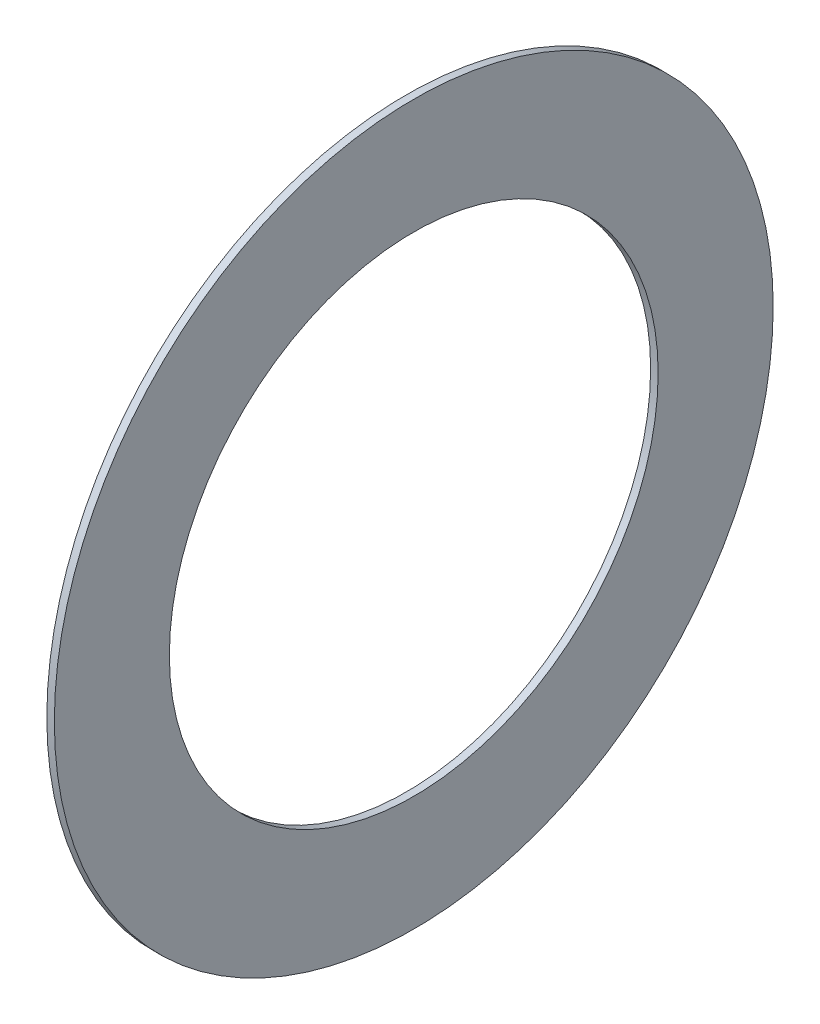
ISO-10303-21;
HEADER;
FILE_DESCRIPTION(('STEP AP214'),'2;1');
FILE_NAME('part.step','',(''),(''),'','','');
FILE_SCHEMA(('AUTOMOTIVE_DESIGN { 1 0 10303 214 1 1 1 1 }'));
ENDSEC;
DATA;
#1=APPLICATION_CONTEXT('core data for automotive mechanical design processes');
#2=APPLICATION_PROTOCOL_DEFINITION('international standard','automotive_design',2000,#1);
#3=PRODUCT_CONTEXT('',#1,'mechanical');
#4=PRODUCT('Part','Part','',(#3));
#5=PRODUCT_RELATED_PRODUCT_CATEGORY('part','',(#4));
#6=PRODUCT_DEFINITION_FORMATION('','',#4);
#7=PRODUCT_DEFINITION_CONTEXT('part definition',#1,'design');
#8=PRODUCT_DEFINITION('design','',#6,#7);
#9=PRODUCT_DEFINITION_SHAPE('','',#8);
#10=(LENGTH_UNIT() NAMED_UNIT(*) SI_UNIT(.MILLI.,.METRE.));
#11=(NAMED_UNIT(*) PLANE_ANGLE_UNIT() SI_UNIT($,.RADIAN.));
#12=(NAMED_UNIT(*) SI_UNIT($,.STERADIAN.) SOLID_ANGLE_UNIT());
#13=UNCERTAINTY_MEASURE_WITH_UNIT(LENGTH_MEASURE(1.E-05),#10,'distance_accuracy_value','');
#14=(GEOMETRIC_REPRESENTATION_CONTEXT(3) GLOBAL_UNCERTAINTY_ASSIGNED_CONTEXT((#13)) GLOBAL_UNIT_ASSIGNED_CONTEXT((#10,
#11,#12)) REPRESENTATION_CONTEXT('',''));
#15=CARTESIAN_POINT('',(0.,0.,0.));
#16=DIRECTION('',(0.,0.,1.));
#17=DIRECTION('',(1.,0.,0.));
#18=AXIS2_PLACEMENT_3D('',#15,#16,#17);
#19=CARTESIAN_POINT('',(0.,-31.6720947790906,-31.325));
#20=DIRECTION('',(-1.,0.,0.));
#21=DIRECTION('',(0.,0.,1.));
#22=AXIS2_PLACEMENT_3D('',#19,#20,#21);
#23=PLANE('',#22);
#24=CARTESIAN_POINT('',(0.,0.,0.));
#25=DIRECTION('',(-1.,0.,0.));
#26=DIRECTION('',(0.,0.,-1.));
#27=AXIS2_PLACEMENT_3D('',#24,#25,#26);
#28=CIRCLE('',#27,31.325);
#29=CARTESIAN_POINT('',(0.,0.,-31.325));
#30=VERTEX_POINT('',#29);
#31=EDGE_CURVE('E29',#30,#30,#28,.F.);
#32=ORIENTED_EDGE('',*,*,#31,.F.);
#33=EDGE_LOOP('',(#32));
#34=FACE_BOUND('',#33,.T.);
#35=CARTESIAN_POINT('',(0.,0.,0.));
#36=DIRECTION('',(1.,0.,0.));
#37=DIRECTION('',(0.,0.,1.));
#38=AXIS2_PLACEMENT_3D('',#35,#36,#37);
#39=CIRCLE('',#38,21.3);
#40=CARTESIAN_POINT('',(0.,0.,21.3));
#41=VERTEX_POINT('',#40);
#42=EDGE_CURVE('E25',#41,#41,#39,.T.);
#43=ORIENTED_EDGE('',*,*,#42,.T.);
#44=EDGE_LOOP('',(#43));
#45=FACE_BOUND('',#44,.T.);
#46=ADVANCED_FACE('F14',(#34,#45),#23,.T.);
#47=CARTESIAN_POINT('',(0.6555,-31.6720947286751,31.325));
#48=DIRECTION('',(1.,0.,0.));
#49=DIRECTION('',(0.,0.,-1.));
#50=AXIS2_PLACEMENT_3D('',#47,#48,#49);
#51=PLANE('',#50);
#52=CARTESIAN_POINT('',(0.6555,0.,0.));
#53=DIRECTION('',(1.,0.,0.));
#54=DIRECTION('',(0.,-1.16848441005481E-09,1.));
#55=AXIS2_PLACEMENT_3D('',#52,#53,#54);
#56=CIRCLE('',#55,31.325);
#57=CARTESIAN_POINT('',(0.6555,-3.6602774144967E-08,31.325));
#58=VERTEX_POINT('',#57);
#59=EDGE_CURVE('E21',#58,#58,#56,.T.);
#60=ORIENTED_EDGE('',*,*,#59,.T.);
#61=EDGE_LOOP('',(#60));
#62=FACE_BOUND('',#61,.T.);
#63=CARTESIAN_POINT('',(0.6555,0.,0.));
#64=DIRECTION('',(-1.,0.,0.));
#65=DIRECTION('',(0.,0.,-1.));
#66=AXIS2_PLACEMENT_3D('',#63,#64,#65);
#67=CIRCLE('',#66,21.3);
#68=CARTESIAN_POINT('',(0.6555,0.,-21.3));
#69=VERTEX_POINT('',#68);
#70=EDGE_CURVE('E10',#69,#69,#67,.F.);
#71=ORIENTED_EDGE('',*,*,#70,.F.);
#72=EDGE_LOOP('',(#71));
#73=FACE_BOUND('',#72,.T.);
#74=ADVANCED_FACE('F39',(#62,#73),#51,.T.);
#75=CARTESIAN_POINT('',(0.6555,0.,0.));
#76=DIRECTION('',(1.,0.,0.));
#77=DIRECTION('',(0.,0.,1.));
#78=AXIS2_PLACEMENT_3D('',#75,#76,#77);
#79=CYLINDRICAL_SURFACE('',#78,21.3);
#80=ORIENTED_EDGE('',*,*,#70,.T.);
#81=EDGE_LOOP('',(#80));
#82=FACE_BOUND('',#81,.T.);
#83=ORIENTED_EDGE('',*,*,#42,.F.);
#84=EDGE_LOOP('',(#83));
#85=FACE_BOUND('',#84,.T.);
#86=ADVANCED_FACE('F43',(#82,#85),#79,.F.);
#87=CARTESIAN_POINT('',(0.6555,0.,0.));
#88=DIRECTION('',(1.,0.,0.));
#89=DIRECTION('',(0.,0.,1.));
#90=AXIS2_PLACEMENT_3D('',#87,#88,#89);
#91=CYLINDRICAL_SURFACE('',#90,31.325);
#92=ORIENTED_EDGE('',*,*,#31,.T.);
#93=EDGE_LOOP('',(#92));
#94=FACE_BOUND('',#93,.T.);
#95=ORIENTED_EDGE('',*,*,#59,.F.);
#96=EDGE_LOOP('',(#95));
#97=FACE_BOUND('',#96,.T.);
#98=ADVANCED_FACE('F16',(#94,#97),#91,.T.);
#99=CLOSED_SHELL('',(#46,#74,#86,#98));
#100=MANIFOLD_SOLID_BREP('B1',#99);
#101=ADVANCED_BREP_SHAPE_REPRESENTATION('',(#18,#100),#14);
#102=SHAPE_DEFINITION_REPRESENTATION(#9,#101);
ENDSEC;
END-ISO-10303-21;
